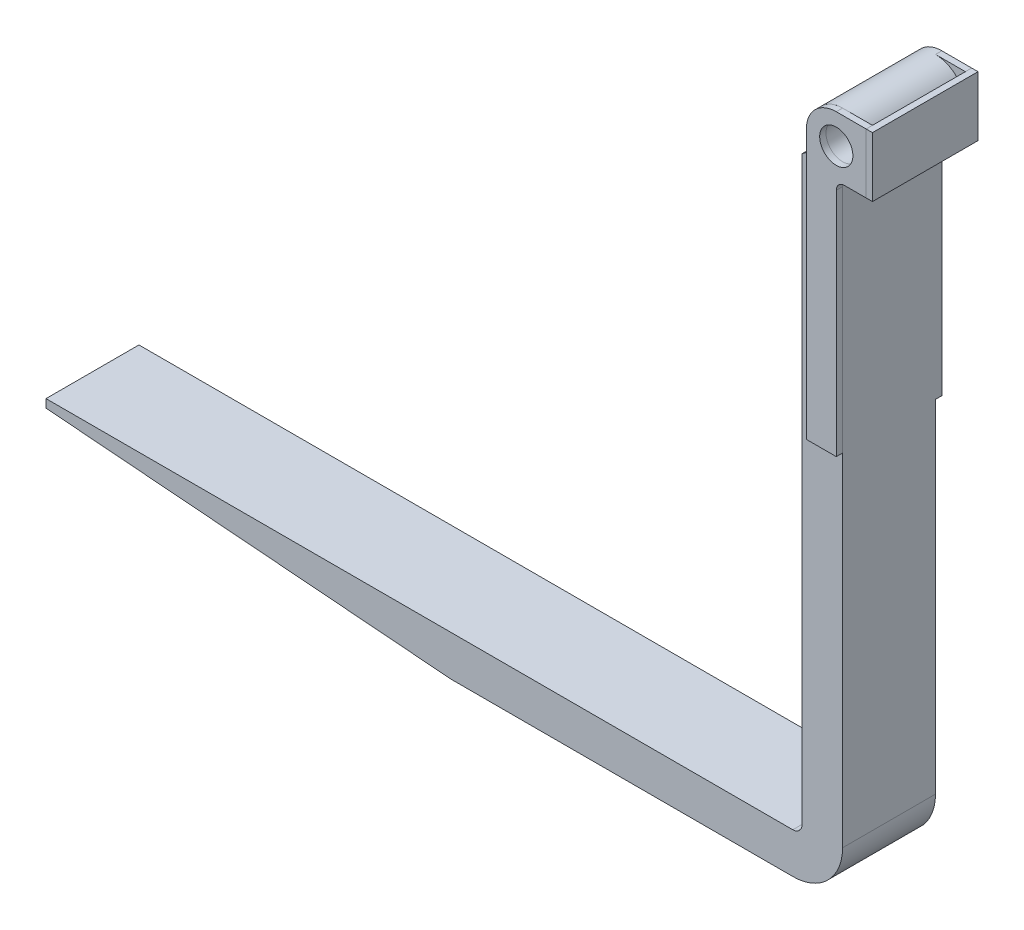
ISO-10303-21;
HEADER;
FILE_DESCRIPTION(('STEP AP214'),'2;1');
FILE_NAME('part.step','',(''),(''),'','','');
FILE_SCHEMA(('AUTOMOTIVE_DESIGN { 1 0 10303 214 1 1 1 1 }'));
ENDSEC;
DATA;
#1=APPLICATION_CONTEXT('core data for automotive mechanical design processes');
#2=APPLICATION_PROTOCOL_DEFINITION('international standard','automotive_design',2000,#1);
#3=PRODUCT_CONTEXT('',#1,'mechanical');
#4=PRODUCT('Part','Part','',(#3));
#5=PRODUCT_RELATED_PRODUCT_CATEGORY('part','',(#4));
#6=PRODUCT_DEFINITION_FORMATION('','',#4);
#7=PRODUCT_DEFINITION_CONTEXT('part definition',#1,'design');
#8=PRODUCT_DEFINITION('design','',#6,#7);
#9=PRODUCT_DEFINITION_SHAPE('','',#8);
#10=(LENGTH_UNIT() NAMED_UNIT(*) SI_UNIT(.MILLI.,.METRE.));
#11=(NAMED_UNIT(*) PLANE_ANGLE_UNIT() SI_UNIT($,.RADIAN.));
#12=(NAMED_UNIT(*) SI_UNIT($,.STERADIAN.) SOLID_ANGLE_UNIT());
#13=UNCERTAINTY_MEASURE_WITH_UNIT(LENGTH_MEASURE(1.E-05),#10,'distance_accuracy_value','');
#14=(GEOMETRIC_REPRESENTATION_CONTEXT(3) GLOBAL_UNCERTAINTY_ASSIGNED_CONTEXT((#13)) GLOBAL_UNIT_ASSIGNED_CONTEXT((#10,
#11,#12)) REPRESENTATION_CONTEXT('',''));
#15=CARTESIAN_POINT('',(0.,0.,0.));
#16=DIRECTION('',(0.,0.,1.));
#17=DIRECTION('',(1.,0.,0.));
#18=AXIS2_PLACEMENT_3D('',#15,#16,#17);
#19=CARTESIAN_POINT('',(54.5,1040.,79.5));
#20=DIRECTION('',(0.,0.,-1.));
#21=DIRECTION('',(-1.,0.,0.));
#22=AXIS2_PLACEMENT_3D('',#19,#20,#21);
#23=PLANE('',#22);
#24=DIRECTION('',(0.,-1.,0.));
#25=VECTOR('',#24,1.);
#26=CARTESIAN_POINT('',(45.,1040.,79.5));
#27=LINE('',#26,#25);
#28=CARTESIAN_POINT('',(45.,1040.,79.5));
#29=VERTEX_POINT('',#28);
#30=CARTESIAN_POINT('',(45.,950.,79.5));
#31=VERTEX_POINT('',#30);
#32=EDGE_CURVE('E110',#29,#31,#27,.T.);
#33=ORIENTED_EDGE('',*,*,#32,.T.);
#34=DIRECTION('',(-1.,0.,0.));
#35=VECTOR('',#34,1.);
#36=CARTESIAN_POINT('',(54.5,950.,79.5));
#37=LINE('',#36,#35);
#38=CARTESIAN_POINT('',(54.5,950.,79.5));
#39=VERTEX_POINT('',#38);
#40=EDGE_CURVE('E12',#39,#31,#37,.T.);
#41=ORIENTED_EDGE('',*,*,#40,.F.);
#42=DIRECTION('',(0.,-1.,0.));
#43=VECTOR('',#42,1.);
#44=CARTESIAN_POINT('',(54.5,1040.,79.5));
#45=LINE('',#44,#43);
#46=CARTESIAN_POINT('',(54.5,1040.,79.5));
#47=VERTEX_POINT('',#46);
#48=EDGE_CURVE('E98',#47,#39,#45,.T.);
#49=ORIENTED_EDGE('',*,*,#48,.F.);
#50=DIRECTION('',(-1.,0.,0.));
#51=VECTOR('',#50,1.);
#52=CARTESIAN_POINT('',(54.5,1040.,79.5));
#53=LINE('',#52,#51);
#54=EDGE_CURVE('E106',#47,#29,#53,.T.);
#55=ORIENTED_EDGE('',*,*,#54,.T.);
#56=EDGE_LOOP('',(#33,#41,#49,#55));
#57=FACE_BOUND('',#56,.T.);
#58=ADVANCED_FACE('F47',(#57),#23,.F.);
#59=CARTESIAN_POINT('',(54.5,950.,79.5));
#60=DIRECTION('',(0.,1.,0.));
#61=DIRECTION('',(0.,0.,1.));
#62=AXIS2_PLACEMENT_3D('',#59,#60,#61);
#63=PLANE('',#62);
#64=DIRECTION('',(0.,0.,-1.));
#65=VECTOR('',#64,1.);
#66=CARTESIAN_POINT('',(45.,950.,79.5));
#67=LINE('',#66,#65);
#68=CARTESIAN_POINT('',(45.,950.,-79.5));
#69=VERTEX_POINT('',#68);
#70=EDGE_CURVE('E102',#31,#69,#67,.T.);
#71=ORIENTED_EDGE('',*,*,#70,.T.);
#72=DIRECTION('',(-1.,0.,0.));
#73=VECTOR('',#72,1.);
#74=CARTESIAN_POINT('',(54.5,950.,-79.5));
#75=LINE('',#74,#73);
#76=CARTESIAN_POINT('',(54.5,950.,-79.5));
#77=VERTEX_POINT('',#76);
#78=EDGE_CURVE('E55',#77,#69,#75,.T.);
#79=ORIENTED_EDGE('',*,*,#78,.F.);
#80=DIRECTION('',(0.,0.,-1.));
#81=VECTOR('',#80,1.);
#82=CARTESIAN_POINT('',(54.5,950.,79.5));
#83=LINE('',#82,#81);
#84=EDGE_CURVE('E93',#39,#77,#83,.T.);
#85=ORIENTED_EDGE('',*,*,#84,.F.);
#86=ORIENTED_EDGE('',*,*,#40,.T.);
#87=EDGE_LOOP('',(#71,#79,#85,#86));
#88=FACE_BOUND('',#87,.T.);
#89=ADVANCED_FACE('F101',(#88),#63,.F.);
#90=CARTESIAN_POINT('',(54.5,1040.,-79.5));
#91=DIRECTION('',(0.,0.,1.));
#92=DIRECTION('',(1.,0.,0.));
#93=AXIS2_PLACEMENT_3D('',#90,#91,#92);
#94=PLANE('',#93);
#95=DIRECTION('',(0.,1.,0.));
#96=VECTOR('',#95,1.);
#97=CARTESIAN_POINT('',(45.,1040.,-79.5));
#98=LINE('',#97,#96);
#99=CARTESIAN_POINT('',(45.,1040.,-79.5));
#100=VERTEX_POINT('',#99);
#101=EDGE_CURVE('E80',#69,#100,#98,.T.);
#102=ORIENTED_EDGE('',*,*,#101,.T.);
#103=DIRECTION('',(-1.,0.,0.));
#104=VECTOR('',#103,1.);
#105=CARTESIAN_POINT('',(54.5,1040.,-79.5));
#106=LINE('',#105,#104);
#107=CARTESIAN_POINT('',(54.5,1040.,-79.5));
#108=VERTEX_POINT('',#107);
#109=EDGE_CURVE('E103',#108,#100,#106,.T.);
#110=ORIENTED_EDGE('',*,*,#109,.F.);
#111=DIRECTION('',(0.,1.,0.));
#112=VECTOR('',#111,1.);
#113=CARTESIAN_POINT('',(54.5,1040.,-79.5));
#114=LINE('',#113,#112);
#115=EDGE_CURVE('E96',#77,#108,#114,.T.);
#116=ORIENTED_EDGE('',*,*,#115,.F.);
#117=ORIENTED_EDGE('',*,*,#78,.T.);
#118=EDGE_LOOP('',(#102,#110,#116,#117));
#119=FACE_BOUND('',#118,.T.);
#120=ADVANCED_FACE('F104',(#119),#94,.F.);
#121=CARTESIAN_POINT('',(54.5,1040.,79.5));
#122=DIRECTION('',(0.,-1.,0.));
#123=DIRECTION('',(0.,0.,-1.));
#124=AXIS2_PLACEMENT_3D('',#121,#122,#123);
#125=PLANE('',#124);
#126=DIRECTION('',(0.,0.,1.));
#127=VECTOR('',#126,1.);
#128=CARTESIAN_POINT('',(45.,1040.,79.5));
#129=LINE('',#128,#127);
#130=EDGE_CURVE('E86',#100,#29,#129,.T.);
#131=ORIENTED_EDGE('',*,*,#130,.T.);
#132=ORIENTED_EDGE('',*,*,#54,.F.);
#133=DIRECTION('',(0.,0.,1.));
#134=VECTOR('',#133,1.);
#135=CARTESIAN_POINT('',(54.5,1040.,79.5));
#136=LINE('',#135,#134);
#137=EDGE_CURVE('E63',#108,#47,#136,.T.);
#138=ORIENTED_EDGE('',*,*,#137,.F.);
#139=ORIENTED_EDGE('',*,*,#109,.T.);
#140=EDGE_LOOP('',(#131,#132,#138,#139));
#141=FACE_BOUND('',#140,.T.);
#142=ADVANCED_FACE('F117',(#141),#125,.F.);
#143=CARTESIAN_POINT('',(54.5,0.,0.));
#144=DIRECTION('',(1.,0.,0.));
#145=DIRECTION('',(0.,0.,-1.));
#146=AXIS2_PLACEMENT_3D('',#143,#144,#145);
#147=PLANE('',#146);
#148=ORIENTED_EDGE('',*,*,#48,.T.);
#149=ORIENTED_EDGE('',*,*,#84,.T.);
#150=ORIENTED_EDGE('',*,*,#115,.T.);
#151=ORIENTED_EDGE('',*,*,#137,.T.);
#152=EDGE_LOOP('',(#148,#149,#150,#151));
#153=FACE_BOUND('',#152,.T.);
#154=ADVANCED_FACE('F94',(#153),#147,.T.);
#155=CARTESIAN_POINT('',(45.,0.,0.));
#156=DIRECTION('',(1.,0.,0.));
#157=DIRECTION('',(0.,0.,-1.));
#158=AXIS2_PLACEMENT_3D('',#155,#156,#157);
#159=PLANE('',#158);
#160=ORIENTED_EDGE('',*,*,#32,.F.);
#161=ORIENTED_EDGE('',*,*,#130,.F.);
#162=ORIENTED_EDGE('',*,*,#101,.F.);
#163=ORIENTED_EDGE('',*,*,#70,.F.);
#164=EDGE_LOOP('',(#160,#161,#162,#163));
#165=FACE_BOUND('',#164,.T.);
#166=ADVANCED_FACE('F120',(#165),#159,.F.);
#167=CLOSED_SHELL('',(#58,#89,#120,#142,#154,#166));
#168=MANIFOLD_SOLID_BREP('B2',#167);
#169=CARTESIAN_POINT('',(0.,995.,79.5));
#170=DIRECTION('',(0.,0.,-1.));
#171=DIRECTION('',(-1.,0.,0.));
#172=AXIS2_PLACEMENT_3D('',#169,#170,#171);
#173=CYLINDRICAL_SURFACE('',#172,45.);
#174=CARTESIAN_POINT('',(0.,995.,70.));
#175=DIRECTION('',(0.,0.,1.));
#176=DIRECTION('',(1.,0.,0.));
#177=AXIS2_PLACEMENT_3D('',#174,#175,#176);
#178=CIRCLE('',#177,45.);
#179=CARTESIAN_POINT('',(0.,1040.,70.));
#180=VERTEX_POINT('',#179);
#181=CARTESIAN_POINT('',(-45.,995.,70.));
#182=VERTEX_POINT('',#181);
#183=EDGE_CURVE('E279',#180,#182,#178,.T.);
#184=ORIENTED_EDGE('',*,*,#183,.T.);
#185=DIRECTION('',(0.,0.,-1.));
#186=VECTOR('',#185,1.);
#187=CARTESIAN_POINT('',(-45.,995.,79.5));
#188=LINE('',#187,#186);
#189=CARTESIAN_POINT('',(-45.,995.,79.5));
#190=VERTEX_POINT('',#189);
#191=EDGE_CURVE('E45',#190,#182,#188,.T.);
#192=ORIENTED_EDGE('',*,*,#191,.F.);
#193=CARTESIAN_POINT('',(0.,995.,79.5));
#194=DIRECTION('',(0.,0.,1.));
#195=DIRECTION('',(1.,0.,0.));
#196=AXIS2_PLACEMENT_3D('',#193,#194,#195);
#197=CIRCLE('',#196,45.);
#198=CARTESIAN_POINT('',(0.,1040.,79.5));
#199=VERTEX_POINT('',#198);
#200=EDGE_CURVE('E325',#199,#190,#197,.T.);
#201=ORIENTED_EDGE('',*,*,#200,.F.);
#202=DIRECTION('',(0.,0.,-1.));
#203=VECTOR('',#202,1.);
#204=CARTESIAN_POINT('',(0.,1040.,79.5));
#205=LINE('',#204,#203);
#206=EDGE_CURVE('E272',#199,#180,#205,.T.);
#207=ORIENTED_EDGE('',*,*,#206,.T.);
#208=EDGE_LOOP('',(#184,#192,#201,#207));
#209=FACE_BOUND('',#208,.T.);
#210=ADVANCED_FACE('F179',(#209),#173,.T.);
#211=CARTESIAN_POINT('',(-45.,0.,79.5));
#212=DIRECTION('',(1.,0.,0.));
#213=DIRECTION('',(0.,0.,-1.));
#214=AXIS2_PLACEMENT_3D('',#211,#212,#213);
#215=PLANE('',#214);
#216=DIRECTION('',(0.,-1.,0.));
#217=VECTOR('',#216,1.);
#218=CARTESIAN_POINT('',(-45.,0.,70.));
#219=LINE('',#218,#217);
#220=CARTESIAN_POINT('',(-45.,590.,70.));
#221=VERTEX_POINT('',#220);
#222=EDGE_CURVE('E282',#182,#221,#219,.T.);
#223=ORIENTED_EDGE('',*,*,#222,.T.);
#224=DIRECTION('',(0.,0.,-1.));
#225=VECTOR('',#224,1.);
#226=CARTESIAN_POINT('',(-45.,590.,79.5));
#227=LINE('',#226,#225);
#228=CARTESIAN_POINT('',(-45.,590.,79.5));
#229=VERTEX_POINT('',#228);
#230=EDGE_CURVE('E188',#229,#221,#227,.T.);
#231=ORIENTED_EDGE('',*,*,#230,.F.);
#232=DIRECTION('',(0.,-1.,0.));
#233=VECTOR('',#232,1.);
#234=CARTESIAN_POINT('',(-45.,0.,79.5));
#235=LINE('',#234,#233);
#236=EDGE_CURVE('E239',#190,#229,#235,.T.);
#237=ORIENTED_EDGE('',*,*,#236,.F.);
#238=ORIENTED_EDGE('',*,*,#191,.T.);
#239=EDGE_LOOP('',(#223,#231,#237,#238));
#240=FACE_BOUND('',#239,.T.);
#241=ADVANCED_FACE('F344',(#240),#215,.F.);
#242=CARTESIAN_POINT('',(0.,590.,79.5));
#243=DIRECTION('',(0.,1.,0.));
#244=DIRECTION('',(0.,0.,1.));
#245=AXIS2_PLACEMENT_3D('',#242,#243,#244);
#246=PLANE('',#245);
#247=DIRECTION('',(1.,0.,0.));
#248=VECTOR('',#247,1.);
#249=CARTESIAN_POINT('',(0.,590.,70.));
#250=LINE('',#249,#248);
#251=CARTESIAN_POINT('',(0.,590.,70.));
#252=VERTEX_POINT('',#251);
#253=EDGE_CURVE('E284',#221,#252,#250,.T.);
#254=ORIENTED_EDGE('',*,*,#253,.T.);
#255=DIRECTION('',(0.,0.,-1.));
#256=VECTOR('',#255,1.);
#257=CARTESIAN_POINT('',(0.,590.,79.5));
#258=LINE('',#257,#256);
#259=CARTESIAN_POINT('',(0.,590.,79.5));
#260=VERTEX_POINT('',#259);
#261=EDGE_CURVE('E300',#260,#252,#258,.T.);
#262=ORIENTED_EDGE('',*,*,#261,.F.);
#263=DIRECTION('',(1.,0.,0.));
#264=VECTOR('',#263,1.);
#265=CARTESIAN_POINT('',(0.,590.,79.5));
#266=LINE('',#265,#264);
#267=EDGE_CURVE('E308',#229,#260,#266,.T.);
#268=ORIENTED_EDGE('',*,*,#267,.F.);
#269=ORIENTED_EDGE('',*,*,#230,.T.);
#270=EDGE_LOOP('',(#254,#262,#268,#269));
#271=FACE_BOUND('',#270,.T.);
#272=ADVANCED_FACE('F306',(#271),#246,.F.);
#273=CARTESIAN_POINT('',(0.,0.,79.5));
#274=DIRECTION('',(-1.,0.,0.));
#275=DIRECTION('',(0.,0.,1.));
#276=AXIS2_PLACEMENT_3D('',#273,#274,#275);
#277=PLANE('',#276);
#278=DIRECTION('',(0.,1.,0.));
#279=VECTOR('',#278,1.);
#280=CARTESIAN_POINT('',(0.,0.,70.));
#281=LINE('',#280,#279);
#282=CARTESIAN_POINT('',(0.,937.5,70.));
#283=VERTEX_POINT('',#282);
#284=EDGE_CURVE('E286',#252,#283,#281,.T.);
#285=ORIENTED_EDGE('',*,*,#284,.T.);
#286=DIRECTION('',(0.,0.,-1.));
#287=VECTOR('',#286,1.);
#288=CARTESIAN_POINT('',(0.,937.5,79.5));
#289=LINE('',#288,#287);
#290=CARTESIAN_POINT('',(0.,937.5,79.5));
#291=VERTEX_POINT('',#290);
#292=EDGE_CURVE('E297',#291,#283,#289,.T.);
#293=ORIENTED_EDGE('',*,*,#292,.F.);
#294=DIRECTION('',(0.,1.,0.));
#295=VECTOR('',#294,1.);
#296=CARTESIAN_POINT('',(0.,0.,79.5));
#297=LINE('',#296,#295);
#298=EDGE_CURVE('E320',#260,#291,#297,.T.);
#299=ORIENTED_EDGE('',*,*,#298,.F.);
#300=ORIENTED_EDGE('',*,*,#261,.T.);
#301=EDGE_LOOP('',(#285,#293,#299,#300));
#302=FACE_BOUND('',#301,.T.);
#303=ADVANCED_FACE('F316',(#302),#277,.F.);
#304=CARTESIAN_POINT('',(12.5,937.5,79.5));
#305=DIRECTION('',(0.,0.,-1.));
#306=DIRECTION('',(-1.,0.,0.));
#307=AXIS2_PLACEMENT_3D('',#304,#305,#306);
#308=CYLINDRICAL_SURFACE('',#307,12.5);
#309=CARTESIAN_POINT('',(12.5,937.5,70.));
#310=DIRECTION('',(0.,0.,1.));
#311=DIRECTION('',(1.,0.,0.));
#312=AXIS2_PLACEMENT_3D('',#309,#310,#311);
#313=CIRCLE('',#312,12.5);
#314=CARTESIAN_POINT('',(12.5000000000001,950.,70.));
#315=VERTEX_POINT('',#314);
#316=EDGE_CURVE('E288',#283,#315,#313,.F.);
#317=ORIENTED_EDGE('',*,*,#316,.T.);
#318=DIRECTION('',(0.,0.,-1.));
#319=VECTOR('',#318,1.);
#320=CARTESIAN_POINT('',(12.5000000000001,950.,79.5));
#321=LINE('',#320,#319);
#322=CARTESIAN_POINT('',(12.5000000000001,950.,79.5));
#323=VERTEX_POINT('',#322);
#324=EDGE_CURVE('E267',#323,#315,#321,.T.);
#325=ORIENTED_EDGE('',*,*,#324,.F.);
#326=CARTESIAN_POINT('',(12.5,937.5,79.5));
#327=DIRECTION('',(0.,0.,1.));
#328=DIRECTION('',(1.,0.,0.));
#329=AXIS2_PLACEMENT_3D('',#326,#327,#328);
#330=CIRCLE('',#329,12.5);
#331=EDGE_CURVE('E258',#291,#323,#330,.F.);
#332=ORIENTED_EDGE('',*,*,#331,.F.);
#333=ORIENTED_EDGE('',*,*,#292,.T.);
#334=EDGE_LOOP('',(#317,#325,#332,#333));
#335=FACE_BOUND('',#334,.T.);
#336=ADVANCED_FACE('F319',(#335),#308,.F.);
#337=CARTESIAN_POINT('',(0.,950.,79.5));
#338=DIRECTION('',(0.,1.,0.));
#339=DIRECTION('',(0.,0.,1.));
#340=AXIS2_PLACEMENT_3D('',#337,#338,#339);
#341=PLANE('',#340);
#342=DIRECTION('',(1.,0.,0.));
#343=VECTOR('',#342,1.);
#344=CARTESIAN_POINT('',(0.,950.,70.));
#345=LINE('',#344,#343);
#346=CARTESIAN_POINT('',(45.,950.,70.));
#347=VERTEX_POINT('',#346);
#348=EDGE_CURVE('E266',#315,#347,#345,.T.);
#349=ORIENTED_EDGE('',*,*,#348,.T.);
#350=DIRECTION('',(0.,0.,-1.));
#351=VECTOR('',#350,1.);
#352=CARTESIAN_POINT('',(45.,950.,79.5));
#353=LINE('',#352,#351);
#354=CARTESIAN_POINT('',(45.,950.,79.5));
#355=VERTEX_POINT('',#354);
#356=EDGE_CURVE('E263',#355,#347,#353,.T.);
#357=ORIENTED_EDGE('',*,*,#356,.F.);
#358=DIRECTION('',(1.,0.,0.));
#359=VECTOR('',#358,1.);
#360=CARTESIAN_POINT('',(0.,950.,79.5));
#361=LINE('',#360,#359);
#362=EDGE_CURVE('E252',#323,#355,#361,.T.);
#363=ORIENTED_EDGE('',*,*,#362,.F.);
#364=ORIENTED_EDGE('',*,*,#324,.T.);
#365=EDGE_LOOP('',(#349,#357,#363,#364));
#366=FACE_BOUND('',#365,.T.);
#367=ADVANCED_FACE('F264',(#366),#341,.F.);
#368=CARTESIAN_POINT('',(45.,0.,79.5));
#369=DIRECTION('',(-1.,0.,0.));
#370=DIRECTION('',(0.,0.,1.));
#371=AXIS2_PLACEMENT_3D('',#368,#369,#370);
#372=PLANE('',#371);
#373=DIRECTION('',(0.,1.,0.));
#374=VECTOR('',#373,1.);
#375=CARTESIAN_POINT('',(45.,0.,70.));
#376=LINE('',#375,#374);
#377=CARTESIAN_POINT('',(45.,1040.,70.));
#378=VERTEX_POINT('',#377);
#379=EDGE_CURVE('E225',#347,#378,#376,.T.);
#380=ORIENTED_EDGE('',*,*,#379,.T.);
#381=DIRECTION('',(0.,0.,-1.));
#382=VECTOR('',#381,1.);
#383=CARTESIAN_POINT('',(45.,1040.,79.5));
#384=LINE('',#383,#382);
#385=CARTESIAN_POINT('',(45.,1040.,79.5));
#386=VERTEX_POINT('',#385);
#387=EDGE_CURVE('E268',#386,#378,#384,.T.);
#388=ORIENTED_EDGE('',*,*,#387,.F.);
#389=DIRECTION('',(0.,1.,0.));
#390=VECTOR('',#389,1.);
#391=CARTESIAN_POINT('',(45.,0.,79.5));
#392=LINE('',#391,#390);
#393=EDGE_CURVE('E256',#355,#386,#392,.T.);
#394=ORIENTED_EDGE('',*,*,#393,.F.);
#395=ORIENTED_EDGE('',*,*,#356,.T.);
#396=EDGE_LOOP('',(#380,#388,#394,#395));
#397=FACE_BOUND('',#396,.T.);
#398=ADVANCED_FACE('F270',(#397),#372,.F.);
#399=CARTESIAN_POINT('',(0.,995.,79.5));
#400=DIRECTION('',(0.,0.,-1.));
#401=DIRECTION('',(-1.,0.,0.));
#402=AXIS2_PLACEMENT_3D('',#399,#400,#401);
#403=CYLINDRICAL_SURFACE('',#402,25.);
#404=CARTESIAN_POINT('',(0.,995.,79.5));
#405=DIRECTION('',(0.,0.,1.));
#406=DIRECTION('',(1.,0.,0.));
#407=AXIS2_PLACEMENT_3D('',#404,#405,#406);
#408=CIRCLE('',#407,25.);
#409=CARTESIAN_POINT('',(25.,995.,79.5));
#410=VERTEX_POINT('',#409);
#411=EDGE_CURVE('E293',#410,#410,#408,.F.);
#412=ORIENTED_EDGE('',*,*,#411,.F.);
#413=EDGE_LOOP('',(#412));
#414=FACE_BOUND('',#413,.T.);
#415=CARTESIAN_POINT('',(0.,995.,70.));
#416=DIRECTION('',(0.,0.,1.));
#417=DIRECTION('',(1.,0.,0.));
#418=AXIS2_PLACEMENT_3D('',#415,#416,#417);
#419=CIRCLE('',#418,25.);
#420=CARTESIAN_POINT('',(25.,995.,70.));
#421=VERTEX_POINT('',#420);
#422=EDGE_CURVE('E276',#421,#421,#419,.F.);
#423=ORIENTED_EDGE('',*,*,#422,.T.);
#424=EDGE_LOOP('',(#423));
#425=FACE_BOUND('',#424,.T.);
#426=ADVANCED_FACE('F181',(#414,#425),#403,.F.);
#427=CARTESIAN_POINT('',(0.,1040.,79.5));
#428=DIRECTION('',(0.,-1.,0.));
#429=DIRECTION('',(0.,0.,-1.));
#430=AXIS2_PLACEMENT_3D('',#427,#428,#429);
#431=PLANE('',#430);
#432=DIRECTION('',(-1.,0.,0.));
#433=VECTOR('',#432,1.);
#434=CARTESIAN_POINT('',(0.,1040.,70.));
#435=LINE('',#434,#433);
#436=EDGE_CURVE('E231',#378,#180,#435,.T.);
#437=ORIENTED_EDGE('',*,*,#436,.T.);
#438=ORIENTED_EDGE('',*,*,#206,.F.);
#439=DIRECTION('',(-1.,0.,0.));
#440=VECTOR('',#439,1.);
#441=CARTESIAN_POINT('',(0.,1040.,79.5));
#442=LINE('',#441,#440);
#443=EDGE_CURVE('E196',#386,#199,#442,.T.);
#444=ORIENTED_EDGE('',*,*,#443,.F.);
#445=ORIENTED_EDGE('',*,*,#387,.T.);
#446=EDGE_LOOP('',(#437,#438,#444,#445));
#447=FACE_BOUND('',#446,.T.);
#448=ADVANCED_FACE('F333',(#447),#431,.F.);
#449=CARTESIAN_POINT('',(0.,0.,79.5));
#450=DIRECTION('',(0.,0.,1.));
#451=DIRECTION('',(1.,0.,0.));
#452=AXIS2_PLACEMENT_3D('',#449,#450,#451);
#453=PLANE('',#452);
#454=ORIENTED_EDGE('',*,*,#411,.T.);
#455=EDGE_LOOP('',(#454));
#456=FACE_BOUND('',#455,.T.);
#457=ORIENTED_EDGE('',*,*,#200,.T.);
#458=ORIENTED_EDGE('',*,*,#236,.T.);
#459=ORIENTED_EDGE('',*,*,#267,.T.);
#460=ORIENTED_EDGE('',*,*,#298,.T.);
#461=ORIENTED_EDGE('',*,*,#331,.T.);
#462=ORIENTED_EDGE('',*,*,#362,.T.);
#463=ORIENTED_EDGE('',*,*,#393,.T.);
#464=ORIENTED_EDGE('',*,*,#443,.T.);
#465=EDGE_LOOP('',(#457,#458,#459,#460,#461,#462,#463,#464));
#466=FACE_BOUND('',#465,.T.);
#467=ADVANCED_FACE('F254',(#456,#466),#453,.T.);
#468=CARTESIAN_POINT('',(0.,0.,70.));
#469=DIRECTION('',(0.,0.,1.));
#470=DIRECTION('',(1.,0.,0.));
#471=AXIS2_PLACEMENT_3D('',#468,#469,#470);
#472=PLANE('',#471);
#473=ORIENTED_EDGE('',*,*,#422,.F.);
#474=EDGE_LOOP('',(#473));
#475=FACE_BOUND('',#474,.T.);
#476=ORIENTED_EDGE('',*,*,#183,.F.);
#477=ORIENTED_EDGE('',*,*,#436,.F.);
#478=ORIENTED_EDGE('',*,*,#379,.F.);
#479=ORIENTED_EDGE('',*,*,#348,.F.);
#480=ORIENTED_EDGE('',*,*,#316,.F.);
#481=ORIENTED_EDGE('',*,*,#284,.F.);
#482=ORIENTED_EDGE('',*,*,#253,.F.);
#483=ORIENTED_EDGE('',*,*,#222,.F.);
#484=EDGE_LOOP('',(#476,#477,#478,#479,#480,#481,#482,#483));
#485=FACE_BOUND('',#484,.T.);
#486=ADVANCED_FACE('F312',(#475,#485),#472,.F.);
#487=CLOSED_SHELL('',(#210,#241,#272,#303,#336,#367,#398,#426,#448,#467,#486));
#488=MANIFOLD_SOLID_BREP('B6',#487);
#489=CARTESIAN_POINT('',(0.,0.,-70.));
#490=DIRECTION('',(0.,0.,-1.));
#491=DIRECTION('',(1.,0.,0.));
#492=AXIS2_PLACEMENT_3D('',#489,#490,#491);
#493=PLANE('',#492);
#494=CARTESIAN_POINT('',(0.,995.,-70.));
#495=DIRECTION('',(0.,0.,-1.));
#496=DIRECTION('',(-1.,0.,0.));
#497=AXIS2_PLACEMENT_3D('',#494,#495,#496);
#498=CIRCLE('',#497,45.);
#499=CARTESIAN_POINT('',(0.,950.,-70.));
#500=VERTEX_POINT('',#499);
#501=CARTESIAN_POINT('',(45.,995.,-70.));
#502=VERTEX_POINT('',#501);
#503=EDGE_CURVE('E594',#500,#502,#498,.F.);
#504=ORIENTED_EDGE('',*,*,#503,.F.);
#505=DIRECTION('',(0.,-1.,0.));
#506=VECTOR('',#505,1.);
#507=CARTESIAN_POINT('',(0.,950.,-70.));
#508=LINE('',#507,#506);
#509=CARTESIAN_POINT('',(0.,937.5,-70.));
#510=VERTEX_POINT('',#509);
#511=EDGE_CURVE('E651',#500,#510,#508,.T.);
#512=ORIENTED_EDGE('',*,*,#511,.T.);
#513=CARTESIAN_POINT('',(12.5,937.5,-70.));
#514=DIRECTION('',(0.,0.,1.));
#515=DIRECTION('',(1.,0.,0.));
#516=AXIS2_PLACEMENT_3D('',#513,#514,#515);
#517=CIRCLE('',#516,12.5);
#518=CARTESIAN_POINT('',(12.5000000000001,950.,-70.));
#519=VERTEX_POINT('',#518);
#520=EDGE_CURVE('E762',#510,#519,#517,.F.);
#521=ORIENTED_EDGE('',*,*,#520,.T.);
#522=DIRECTION('',(1.,0.,0.));
#523=VECTOR('',#522,1.);
#524=CARTESIAN_POINT('',(0.,950.,-70.));
#525=LINE('',#524,#523);
#526=CARTESIAN_POINT('',(45.,950.,-70.));
#527=VERTEX_POINT('',#526);
#528=EDGE_CURVE('E754',#519,#527,#525,.T.);
#529=ORIENTED_EDGE('',*,*,#528,.T.);
#530=DIRECTION('',(0.,1.,0.));
#531=VECTOR('',#530,1.);
#532=CARTESIAN_POINT('',(45.,0.,-70.));
#533=LINE('',#532,#531);
#534=EDGE_CURVE('E654',#527,#502,#533,.T.);
#535=ORIENTED_EDGE('',*,*,#534,.T.);
#536=EDGE_LOOP('',(#504,#512,#521,#529,#535));
#537=FACE_BOUND('',#536,.T.);
#538=ADVANCED_FACE('F442',(#537),#493,.F.);
#539=CARTESIAN_POINT('',(0.,995.,-70.));
#540=DIRECTION('',(0.,0.,1.));
#541=DIRECTION('',(1.,0.,0.));
#542=AXIS2_PLACEMENT_3D('',#539,#540,#541);
#543=CIRCLE('',#542,45.);
#544=CARTESIAN_POINT('',(0.,1040.,-70.));
#545=VERTEX_POINT('',#544);
#546=EDGE_CURVE('E467',#502,#545,#543,.T.);
#547=ORIENTED_EDGE('',*,*,#546,.F.);
#548=CARTESIAN_POINT('',(45.,1040.,-70.));
#549=VERTEX_POINT('',#548);
#550=EDGE_CURVE('E747',#502,#549,#533,.T.);
#551=ORIENTED_EDGE('',*,*,#550,.T.);
#552=DIRECTION('',(-1.,0.,0.));
#553=VECTOR('',#552,1.);
#554=CARTESIAN_POINT('',(0.,1040.,-70.));
#555=LINE('',#554,#553);
#556=EDGE_CURVE('E633',#549,#545,#555,.T.);
#557=ORIENTED_EDGE('',*,*,#556,.T.);
#558=EDGE_LOOP('',(#547,#551,#557));
#559=FACE_BOUND('',#558,.T.);
#560=ADVANCED_FACE('F787',(#559),#493,.F.);
#561=CARTESIAN_POINT('',(-75.,75.,-70.));
#562=DIRECTION('',(0.,0.,-1.));
#563=DIRECTION('',(-1.,0.,0.));
#564=AXIS2_PLACEMENT_3D('',#561,#562,#563);
#565=PLANE('',#564);
#566=DIRECTION('',(0.,1.,0.));
#567=VECTOR('',#566,1.);
#568=CARTESIAN_POINT('',(-61.,950.,-70.));
#569=LINE('',#568,#567);
#570=CARTESIAN_POINT('',(-61.,950.,-70.));
#571=VERTEX_POINT('',#570);
#572=CARTESIAN_POINT('',(-61.,75.0000000000001,-70.));
#573=VERTEX_POINT('',#572);
#574=EDGE_CURVE('E661',#571,#573,#569,.F.);
#575=ORIENTED_EDGE('',*,*,#574,.F.);
#576=DIRECTION('',(0.80472413028408,0.593648948570223,0.));
#577=VECTOR('',#576,1.);
#578=CARTESIAN_POINT('',(-475.33501566307,644.343021232162,-70.));
#579=LINE('',#578,#577);
#580=CARTESIAN_POINT('',(-45.,961.803278688525,-70.));
#581=VERTEX_POINT('',#580);
#582=EDGE_CURVE('E585',#571,#581,#579,.T.);
#583=ORIENTED_EDGE('',*,*,#582,.T.);
#584=DIRECTION('',(0.,-1.,0.));
#585=VECTOR('',#584,1.);
#586=CARTESIAN_POINT('',(-45.,0.,-70.));
#587=LINE('',#586,#585);
#588=CARTESIAN_POINT('',(-45.,590.,-70.));
#589=VERTEX_POINT('',#588);
#590=EDGE_CURVE('E177',#581,#589,#587,.T.);
#591=ORIENTED_EDGE('',*,*,#590,.T.);
#592=DIRECTION('',(1.,0.,0.));
#593=VECTOR('',#592,1.);
#594=CARTESIAN_POINT('',(0.,590.,-70.));
#595=LINE('',#594,#593);
#596=CARTESIAN_POINT('',(0.,590.,-70.));
#597=VERTEX_POINT('',#596);
#598=EDGE_CURVE('E771',#589,#597,#595,.T.);
#599=ORIENTED_EDGE('',*,*,#598,.T.);
#600=CARTESIAN_POINT('',(0.,75.0000000000005,-70.));
#601=VERTEX_POINT('',#600);
#602=EDGE_CURVE('E662',#597,#601,#508,.T.);
#603=ORIENTED_EDGE('',*,*,#602,.T.);
#604=CARTESIAN_POINT('',(-75.,75.,-70.));
#605=DIRECTION('',(0.,0.,-1.));
#606=DIRECTION('',(-1.,0.,0.));
#607=AXIS2_PLACEMENT_3D('',#604,#605,#606);
#608=CIRCLE('',#607,75.);
#609=CARTESIAN_POINT('',(-75.0000000000005,0.,-70.));
#610=VERTEX_POINT('',#609);
#611=EDGE_CURVE('E666',#601,#610,#608,.T.);
#612=ORIENTED_EDGE('',*,*,#611,.T.);
#613=DIRECTION('',(-1.,0.,0.));
#614=VECTOR('',#613,1.);
#615=CARTESIAN_POINT('',(-75.0000000000005,0.,-70.));
#616=LINE('',#615,#614);
#617=CARTESIAN_POINT('',(-590.,0.,-69.9999999999998));
#618=VERTEX_POINT('',#617);
#619=EDGE_CURVE('E714',#610,#618,#616,.T.);
#620=ORIENTED_EDGE('',*,*,#619,.T.);
#621=DIRECTION('',(0.996854130580606,-0.0792580743166545,0.));
#622=VECTOR('',#621,1.);
#623=CARTESIAN_POINT('',(-84.1608042146895,-40.2183622878484,-70.));
#624=LINE('',#623,#622);
#625=CARTESIAN_POINT('',(-1200.,48.4999999999998,-70.));
#626=VERTEX_POINT('',#625);
#627=EDGE_CURVE('E451',#626,#618,#624,.T.);
#628=ORIENTED_EDGE('',*,*,#627,.F.);
#629=DIRECTION('',(0.,1.,0.));
#630=VECTOR('',#629,1.);
#631=CARTESIAN_POINT('',(-1200.,-1.46957615897682E-13,-70.));
#632=LINE('',#631,#630);
#633=CARTESIAN_POINT('',(-1200.,60.9999999999998,-70.));
#634=VERTEX_POINT('',#633);
#635=EDGE_CURVE('E711',#626,#634,#632,.T.);
#636=ORIENTED_EDGE('',*,*,#635,.T.);
#637=DIRECTION('',(-1.,0.,0.));
#638=VECTOR('',#637,1.);
#639=CARTESIAN_POINT('',(-75.0000000000005,61.,-70.));
#640=LINE('',#639,#638);
#641=CARTESIAN_POINT('',(-75.0000000000005,61.,-70.));
#642=VERTEX_POINT('',#641);
#643=EDGE_CURVE('E716',#642,#634,#640,.T.);
#644=ORIENTED_EDGE('',*,*,#643,.F.);
#645=CARTESIAN_POINT('',(-75.,75.,-70.));
#646=DIRECTION('',(0.,0.,1.));
#647=DIRECTION('',(1.,0.,0.));
#648=AXIS2_PLACEMENT_3D('',#645,#646,#647);
#649=CIRCLE('',#648,14.);
#650=EDGE_CURVE('E664',#573,#642,#649,.F.);
#651=ORIENTED_EDGE('',*,*,#650,.F.);
#652=EDGE_LOOP('',(#575,#583,#591,#599,#603,#612,#620,#628,#636,#644,#651));
#653=FACE_BOUND('',#652,.T.);
#654=ADVANCED_FACE('F709',(#653),#565,.T.);
#655=CARTESIAN_POINT('',(-75.0000000000005,61.,70.));
#656=DIRECTION('',(0.,-1.,0.));
#657=DIRECTION('',(1.,0.,0.));
#658=AXIS2_PLACEMENT_3D('',#655,#656,#657);
#659=PLANE('',#658);
#660=ORIENTED_EDGE('',*,*,#643,.T.);
#661=DIRECTION('',(0.,0.,-1.));
#662=VECTOR('',#661,1.);
#663=CARTESIAN_POINT('',(-1200.,60.9999999999998,70.));
#664=LINE('',#663,#662);
#665=CARTESIAN_POINT('',(-1200.,60.9999999999998,70.));
#666=VERTEX_POINT('',#665);
#667=EDGE_CURVE('E692',#666,#634,#664,.T.);
#668=ORIENTED_EDGE('',*,*,#667,.F.);
#669=DIRECTION('',(-1.,0.,0.));
#670=VECTOR('',#669,1.);
#671=CARTESIAN_POINT('',(-75.0000000000005,61.,70.));
#672=LINE('',#671,#670);
#673=CARTESIAN_POINT('',(-75.0000000000005,61.,70.));
#674=VERTEX_POINT('',#673);
#675=EDGE_CURVE('E678',#674,#666,#672,.T.);
#676=ORIENTED_EDGE('',*,*,#675,.F.);
#677=DIRECTION('',(0.,0.,-1.));
#678=VECTOR('',#677,1.);
#679=CARTESIAN_POINT('',(-75.0000000000005,61.,70.));
#680=LINE('',#679,#678);
#681=EDGE_CURVE('E679',#674,#642,#680,.T.);
#682=ORIENTED_EDGE('',*,*,#681,.T.);
#683=EDGE_LOOP('',(#660,#668,#676,#682));
#684=FACE_BOUND('',#683,.T.);
#685=ADVANCED_FACE('F444',(#684),#659,.F.);
#686=CARTESIAN_POINT('',(-1200.,-1.46957615897682E-13,70.));
#687=DIRECTION('',(-1.,0.,0.));
#688=DIRECTION('',(0.,-1.,0.));
#689=AXIS2_PLACEMENT_3D('',#686,#687,#688);
#690=PLANE('',#689);
#691=DIRECTION('',(0.,0.,-1.));
#692=VECTOR('',#691,1.);
#693=CARTESIAN_POINT('',(-1200.,48.4999999999999,2166.14061172003));
#694=LINE('',#693,#692);
#695=CARTESIAN_POINT('',(-1200.,48.4999999999998,70.));
#696=VERTEX_POINT('',#695);
#697=EDGE_CURVE('E706',#696,#626,#694,.T.);
#698=ORIENTED_EDGE('',*,*,#697,.F.);
#699=DIRECTION('',(0.,1.,0.));
#700=VECTOR('',#699,1.);
#701=CARTESIAN_POINT('',(-1200.,-1.46957615897682E-13,70.));
#702=LINE('',#701,#700);
#703=EDGE_CURVE('E731',#696,#666,#702,.T.);
#704=ORIENTED_EDGE('',*,*,#703,.T.);
#705=ORIENTED_EDGE('',*,*,#667,.T.);
#706=ORIENTED_EDGE('',*,*,#635,.F.);
#707=EDGE_LOOP('',(#698,#704,#705,#706));
#708=FACE_BOUND('',#707,.T.);
#709=ADVANCED_FACE('F715',(#708),#690,.T.);
#710=CARTESIAN_POINT('',(-75.0000000000005,0.,70.));
#711=DIRECTION('',(0.,-1.,0.));
#712=DIRECTION('',(1.,0.,0.));
#713=AXIS2_PLACEMENT_3D('',#710,#711,#712);
#714=PLANE('',#713);
#715=DIRECTION('',(0.,0.,-1.));
#716=VECTOR('',#715,1.);
#717=CARTESIAN_POINT('',(-590.,0.,2166.14061172003));
#718=LINE('',#717,#716);
#719=CARTESIAN_POINT('',(-589.999999999999,0.,70.));
#720=VERTEX_POINT('',#719);
#721=EDGE_CURVE('E705',#720,#618,#718,.T.);
#722=ORIENTED_EDGE('',*,*,#721,.T.);
#723=ORIENTED_EDGE('',*,*,#619,.F.);
#724=DIRECTION('',(0.,0.,-1.));
#725=VECTOR('',#724,1.);
#726=CARTESIAN_POINT('',(-75.0000000000005,0.,70.));
#727=LINE('',#726,#725);
#728=CARTESIAN_POINT('',(-75.0000000000005,0.,70.));
#729=VERTEX_POINT('',#728);
#730=EDGE_CURVE('E691',#729,#610,#727,.T.);
#731=ORIENTED_EDGE('',*,*,#730,.F.);
#732=DIRECTION('',(-1.,0.,0.));
#733=VECTOR('',#732,1.);
#734=CARTESIAN_POINT('',(-75.0000000000005,0.,70.));
#735=LINE('',#734,#733);
#736=EDGE_CURVE('E728',#729,#720,#735,.T.);
#737=ORIENTED_EDGE('',*,*,#736,.T.);
#738=EDGE_LOOP('',(#722,#723,#731,#737));
#739=FACE_BOUND('',#738,.T.);
#740=ADVANCED_FACE('F823',(#739),#714,.T.);
#741=CARTESIAN_POINT('',(-75.,75.,70.));
#742=DIRECTION('',(0.,0.,-1.));
#743=DIRECTION('',(-1.,0.,0.));
#744=AXIS2_PLACEMENT_3D('',#741,#742,#743);
#745=CYLINDRICAL_SURFACE('',#744,75.);
#746=ORIENTED_EDGE('',*,*,#611,.F.);
#747=DIRECTION('',(0.,0.,-1.));
#748=VECTOR('',#747,1.);
#749=CARTESIAN_POINT('',(0.,75.0000000000005,70.));
#750=LINE('',#749,#748);
#751=CARTESIAN_POINT('',(0.,75.0000000000005,70.));
#752=VERTEX_POINT('',#751);
#753=EDGE_CURVE('E688',#752,#601,#750,.T.);
#754=ORIENTED_EDGE('',*,*,#753,.F.);
#755=CARTESIAN_POINT('',(-75.,75.,70.));
#756=DIRECTION('',(0.,0.,-1.));
#757=DIRECTION('',(-1.,0.,0.));
#758=AXIS2_PLACEMENT_3D('',#755,#756,#757);
#759=CIRCLE('',#758,75.);
#760=EDGE_CURVE('E725',#752,#729,#759,.T.);
#761=ORIENTED_EDGE('',*,*,#760,.T.);
#762=ORIENTED_EDGE('',*,*,#730,.T.);
#763=EDGE_LOOP('',(#746,#754,#761,#762));
#764=FACE_BOUND('',#763,.T.);
#765=ADVANCED_FACE('F827',(#764),#745,.T.);
#766=CARTESIAN_POINT('',(0.,950.,70.));
#767=DIRECTION('',(1.,0.,0.));
#768=DIRECTION('',(0.,0.,-1.));
#769=AXIS2_PLACEMENT_3D('',#766,#767,#768);
#770=PLANE('',#769);
#771=DIRECTION('',(0.,0.,1.));
#772=VECTOR('',#771,1.);
#773=CARTESIAN_POINT('',(0.,937.5,-79.5));
#774=LINE('',#773,#772);
#775=CARTESIAN_POINT('',(0.,937.5,-79.5));
#776=VERTEX_POINT('',#775);
#777=EDGE_CURVE('E660',#776,#510,#774,.T.);
#778=ORIENTED_EDGE('',*,*,#777,.T.);
#779=ORIENTED_EDGE('',*,*,#511,.F.);
#780=DIRECTION('',(0.,0.,-1.));
#781=VECTOR('',#780,1.);
#782=CARTESIAN_POINT('',(0.,950.,70.));
#783=LINE('',#782,#781);
#784=CARTESIAN_POINT('',(0.,950.,70.));
#785=VERTEX_POINT('',#784);
#786=EDGE_CURVE('E646',#785,#500,#783,.T.);
#787=ORIENTED_EDGE('',*,*,#786,.F.);
#788=DIRECTION('',(0.,-1.,0.));
#789=VECTOR('',#788,1.);
#790=CARTESIAN_POINT('',(0.,950.,70.));
#791=LINE('',#790,#789);
#792=EDGE_CURVE('E602',#785,#752,#791,.T.);
#793=ORIENTED_EDGE('',*,*,#792,.T.);
#794=ORIENTED_EDGE('',*,*,#753,.T.);
#795=ORIENTED_EDGE('',*,*,#602,.F.);
#796=DIRECTION('',(0.,0.,1.));
#797=VECTOR('',#796,1.);
#798=CARTESIAN_POINT('',(0.,590.,-79.5));
#799=LINE('',#798,#797);
#800=CARTESIAN_POINT('',(0.,590.,-79.5));
#801=VERTEX_POINT('',#800);
#802=EDGE_CURVE('E768',#801,#597,#799,.T.);
#803=ORIENTED_EDGE('',*,*,#802,.F.);
#804=DIRECTION('',(0.,1.,0.));
#805=VECTOR('',#804,1.);
#806=CARTESIAN_POINT('',(0.,0.,-79.5));
#807=LINE('',#806,#805);
#808=EDGE_CURVE('E763',#801,#776,#807,.T.);
#809=ORIENTED_EDGE('',*,*,#808,.T.);
#810=EDGE_LOOP('',(#778,#779,#787,#793,#794,#795,#803,#809));
#811=FACE_BOUND('',#810,.T.);
#812=ADVANCED_FACE('F657',(#811),#770,.T.);
#813=CARTESIAN_POINT('',(-61.,950.,70.));
#814=DIRECTION('',(1.,0.,0.));
#815=DIRECTION('',(0.,0.,-1.));
#816=AXIS2_PLACEMENT_3D('',#813,#814,#815);
#817=PLANE('',#816);
#818=ORIENTED_EDGE('',*,*,#574,.T.);
#819=DIRECTION('',(0.,0.,-1.));
#820=VECTOR('',#819,1.);
#821=CARTESIAN_POINT('',(-61.,75.0000000000001,70.));
#822=LINE('',#821,#820);
#823=CARTESIAN_POINT('',(-61.,75.0000000000001,70.));
#824=VERTEX_POINT('',#823);
#825=EDGE_CURVE('E682',#824,#573,#822,.T.);
#826=ORIENTED_EDGE('',*,*,#825,.F.);
#827=DIRECTION('',(0.,1.,0.));
#828=VECTOR('',#827,1.);
#829=CARTESIAN_POINT('',(-61.,950.,70.));
#830=LINE('',#829,#828);
#831=CARTESIAN_POINT('',(-61.,950.,70.));
#832=VERTEX_POINT('',#831);
#833=EDGE_CURVE('E722',#832,#824,#830,.F.);
#834=ORIENTED_EDGE('',*,*,#833,.F.);
#835=DIRECTION('',(0.,0.,-1.));
#836=VECTOR('',#835,1.);
#837=CARTESIAN_POINT('',(-61.,950.,70.));
#838=LINE('',#837,#836);
#839=EDGE_CURVE('E582',#832,#571,#838,.T.);
#840=ORIENTED_EDGE('',*,*,#839,.T.);
#841=EDGE_LOOP('',(#818,#826,#834,#840));
#842=FACE_BOUND('',#841,.T.);
#843=ADVANCED_FACE('F812',(#842),#817,.F.);
#844=CARTESIAN_POINT('',(-75.,75.,70.));
#845=DIRECTION('',(0.,0.,-1.));
#846=DIRECTION('',(-1.,0.,0.));
#847=AXIS2_PLACEMENT_3D('',#844,#845,#846);
#848=CYLINDRICAL_SURFACE('',#847,14.);
#849=ORIENTED_EDGE('',*,*,#650,.T.);
#850=ORIENTED_EDGE('',*,*,#681,.F.);
#851=CARTESIAN_POINT('',(-75.,75.,70.));
#852=DIRECTION('',(0.,0.,1.));
#853=DIRECTION('',(1.,0.,0.));
#854=AXIS2_PLACEMENT_3D('',#851,#852,#853);
#855=CIRCLE('',#854,14.);
#856=EDGE_CURVE('E683',#824,#674,#855,.F.);
#857=ORIENTED_EDGE('',*,*,#856,.F.);
#858=ORIENTED_EDGE('',*,*,#825,.T.);
#859=EDGE_LOOP('',(#849,#850,#857,#858));
#860=FACE_BOUND('',#859,.T.);
#861=ADVANCED_FACE('F815',(#860),#848,.F.);
#862=CARTESIAN_POINT('',(-75.,75.,70.));
#863=DIRECTION('',(0.,0.,-1.));
#864=DIRECTION('',(-1.,0.,0.));
#865=AXIS2_PLACEMENT_3D('',#862,#863,#864);
#866=PLANE('',#865);
#867=ORIENTED_EDGE('',*,*,#703,.F.);
#868=DIRECTION('',(0.996854130580606,-0.0792580743166545,0.));
#869=VECTOR('',#868,1.);
#870=CARTESIAN_POINT('',(-84.1608042146895,-40.2183622878484,70.));
#871=LINE('',#870,#869);
#872=EDGE_CURVE('E718',#696,#720,#871,.T.);
#873=ORIENTED_EDGE('',*,*,#872,.T.);
#874=ORIENTED_EDGE('',*,*,#736,.F.);
#875=ORIENTED_EDGE('',*,*,#760,.F.);
#876=ORIENTED_EDGE('',*,*,#792,.F.);
#877=CARTESIAN_POINT('',(0.,995.,70.));
#878=DIRECTION('',(0.,0.,1.));
#879=DIRECTION('',(1.,0.,0.));
#880=AXIS2_PLACEMENT_3D('',#877,#878,#879);
#881=CIRCLE('',#880,45.);
#882=CARTESIAN_POINT('',(-36.2125858627836,968.28579731434,70.));
#883=VERTEX_POINT('',#882);
#884=EDGE_CURVE('E592',#785,#883,#881,.T.);
#885=ORIENTED_EDGE('',*,*,#884,.T.);
#886=DIRECTION('',(0.80472413028408,0.593648948570223,0.));
#887=VECTOR('',#886,1.);
#888=CARTESIAN_POINT('',(-475.33501566307,644.343021232162,70.));
#889=LINE('',#888,#887);
#890=EDGE_CURVE('E576',#832,#883,#889,.T.);
#891=ORIENTED_EDGE('',*,*,#890,.F.);
#892=ORIENTED_EDGE('',*,*,#833,.T.);
#893=ORIENTED_EDGE('',*,*,#856,.T.);
#894=ORIENTED_EDGE('',*,*,#675,.T.);
#895=EDGE_LOOP('',(#867,#873,#874,#875,#876,#885,#891,#892,#893,#894));
#896=FACE_BOUND('',#895,.T.);
#897=CARTESIAN_POINT('',(0.,995.,70.));
#898=DIRECTION('',(0.,0.,1.));
#899=DIRECTION('',(1.,0.,0.));
#900=AXIS2_PLACEMENT_3D('',#897,#898,#899);
#901=CIRCLE('',#900,25.);
#902=CARTESIAN_POINT('',(25.,995.,70.));
#903=VERTEX_POINT('',#902);
#904=EDGE_CURVE('E608',#903,#903,#901,.T.);
#905=ORIENTED_EDGE('',*,*,#904,.F.);
#906=EDGE_LOOP('',(#905));
#907=FACE_BOUND('',#906,.T.);
#908=ADVANCED_FACE('F598',(#896,#907),#866,.F.);
#909=CARTESIAN_POINT('',(-1200.,48.4999999999999,2166.14061172003));
#910=DIRECTION('',(0.0792580743166545,0.996854130580606,0.));
#911=DIRECTION('',(-0.996854130580606,0.0792580743166545,0.));
#912=AXIS2_PLACEMENT_3D('',#909,#910,#911);
#913=PLANE('',#912);
#914=ORIENTED_EDGE('',*,*,#872,.F.);
#915=ORIENTED_EDGE('',*,*,#697,.T.);
#916=ORIENTED_EDGE('',*,*,#627,.T.);
#917=ORIENTED_EDGE('',*,*,#721,.F.);
#918=EDGE_LOOP('',(#914,#915,#916,#917));
#919=FACE_BOUND('',#918,.T.);
#920=ADVANCED_FACE('F703',(#919),#913,.F.);
#921=CARTESIAN_POINT('',(0.,995.,-79.5));
#922=DIRECTION('',(0.,0.,1.));
#923=DIRECTION('',(-1.,0.,0.));
#924=AXIS2_PLACEMENT_3D('',#921,#922,#923);
#925=CYLINDRICAL_SURFACE('',#924,45.);
#926=DIRECTION('',(0.,0.,1.));
#927=VECTOR('',#926,1.);
#928=CARTESIAN_POINT('',(-45.,995.,-79.5));
#929=LINE('',#928,#927);
#930=CARTESIAN_POINT('',(-45.,995.,-79.5));
#931=VERTEX_POINT('',#930);
#932=CARTESIAN_POINT('',(-45.,995.,-70.));
#933=VERTEX_POINT('',#932);
#934=EDGE_CURVE('E616',#931,#933,#929,.T.);
#935=ORIENTED_EDGE('',*,*,#934,.T.);
#936=CARTESIAN_POINT('',(-36.2125858627836,968.28579731434,-70.));
#937=VERTEX_POINT('',#936);
#938=EDGE_CURVE('E593',#933,#937,#543,.T.);
#939=ORIENTED_EDGE('',*,*,#938,.T.);
#940=DIRECTION('',(0.,0.,-1.));
#941=VECTOR('',#940,1.);
#942=CARTESIAN_POINT('',(-36.2125858627836,968.28579731434,70.));
#943=LINE('',#942,#941);
#944=EDGE_CURVE('E580',#883,#937,#943,.T.);
#945=ORIENTED_EDGE('',*,*,#944,.F.);
#946=ORIENTED_EDGE('',*,*,#884,.F.);
#947=ORIENTED_EDGE('',*,*,#786,.T.);
#948=ORIENTED_EDGE('',*,*,#503,.T.);
#949=ORIENTED_EDGE('',*,*,#546,.T.);
#950=DIRECTION('',(0.,0.,1.));
#951=VECTOR('',#950,1.);
#952=CARTESIAN_POINT('',(0.,1040.,-79.5));
#953=LINE('',#952,#951);
#954=CARTESIAN_POINT('',(0.,1040.,-79.5));
#955=VERTEX_POINT('',#954);
#956=EDGE_CURVE('E619',#955,#545,#953,.T.);
#957=ORIENTED_EDGE('',*,*,#956,.F.);
#958=CARTESIAN_POINT('',(0.,995.,-79.5));
#959=DIRECTION('',(0.,0.,1.));
#960=DIRECTION('',(1.,0.,0.));
#961=AXIS2_PLACEMENT_3D('',#958,#959,#960);
#962=CIRCLE('',#961,45.);
#963=EDGE_CURVE('E617',#955,#931,#962,.T.);
#964=ORIENTED_EDGE('',*,*,#963,.T.);
#965=EDGE_LOOP('',(#935,#939,#945,#946,#947,#948,#949,#957,#964));
#966=FACE_BOUND('',#965,.T.);
#967=ADVANCED_FACE('F590',(#966),#925,.T.);
#968=CARTESIAN_POINT('',(-45.,0.,-79.5));
#969=DIRECTION('',(1.,0.,0.));
#970=DIRECTION('',(0.,0.,1.));
#971=AXIS2_PLACEMENT_3D('',#968,#969,#970);
#972=PLANE('',#971);
#973=EDGE_CURVE('E625',#933,#581,#587,.T.);
#974=ORIENTED_EDGE('',*,*,#973,.F.);
#975=ORIENTED_EDGE('',*,*,#934,.F.);
#976=DIRECTION('',(0.,-1.,0.));
#977=VECTOR('',#976,1.);
#978=CARTESIAN_POINT('',(-45.,0.,-79.5));
#979=LINE('',#978,#977);
#980=CARTESIAN_POINT('',(-45.,590.,-79.5));
#981=VERTEX_POINT('',#980);
#982=EDGE_CURVE('E770',#931,#981,#979,.T.);
#983=ORIENTED_EDGE('',*,*,#982,.T.);
#984=DIRECTION('',(0.,0.,1.));
#985=VECTOR('',#984,1.);
#986=CARTESIAN_POINT('',(-45.,590.,-79.5));
#987=LINE('',#986,#985);
#988=EDGE_CURVE('E622',#981,#589,#987,.T.);
#989=ORIENTED_EDGE('',*,*,#988,.T.);
#990=ORIENTED_EDGE('',*,*,#590,.F.);
#991=EDGE_LOOP('',(#974,#975,#983,#989,#990));
#992=FACE_BOUND('',#991,.T.);
#993=ADVANCED_FACE('F845',(#992),#972,.F.);
#994=CARTESIAN_POINT('',(0.,590.,-79.5));
#995=DIRECTION('',(0.,1.,0.));
#996=DIRECTION('',(0.,0.,-1.));
#997=AXIS2_PLACEMENT_3D('',#994,#995,#996);
#998=PLANE('',#997);
#999=ORIENTED_EDGE('',*,*,#598,.F.);
#1000=ORIENTED_EDGE('',*,*,#988,.F.);
#1001=DIRECTION('',(1.,0.,0.));
#1002=VECTOR('',#1001,1.);
#1003=CARTESIAN_POINT('',(0.,590.,-79.5));
#1004=LINE('',#1003,#1002);
#1005=EDGE_CURVE('E765',#981,#801,#1004,.T.);
#1006=ORIENTED_EDGE('',*,*,#1005,.T.);
#1007=ORIENTED_EDGE('',*,*,#802,.T.);
#1008=EDGE_LOOP('',(#999,#1000,#1006,#1007));
#1009=FACE_BOUND('',#1008,.T.);
#1010=ADVANCED_FACE('F850',(#1009),#998,.F.);
#1011=CARTESIAN_POINT('',(12.5,937.5,-79.5));
#1012=DIRECTION('',(0.,0.,1.));
#1013=DIRECTION('',(-1.,0.,0.));
#1014=AXIS2_PLACEMENT_3D('',#1011,#1012,#1013);
#1015=CYLINDRICAL_SURFACE('',#1014,12.5);
#1016=ORIENTED_EDGE('',*,*,#520,.F.);
#1017=ORIENTED_EDGE('',*,*,#777,.F.);
#1018=CARTESIAN_POINT('',(12.5,937.5,-79.5));
#1019=DIRECTION('',(0.,0.,1.));
#1020=DIRECTION('',(1.,0.,0.));
#1021=AXIS2_PLACEMENT_3D('',#1018,#1019,#1020);
#1022=CIRCLE('',#1021,12.5);
#1023=CARTESIAN_POINT('',(12.5000000000001,950.,-79.5));
#1024=VERTEX_POINT('',#1023);
#1025=EDGE_CURVE('E756',#776,#1024,#1022,.F.);
#1026=ORIENTED_EDGE('',*,*,#1025,.T.);
#1027=DIRECTION('',(0.,0.,1.));
#1028=VECTOR('',#1027,1.);
#1029=CARTESIAN_POINT('',(12.5000000000001,950.,-79.5));
#1030=LINE('',#1029,#1028);
#1031=EDGE_CURVE('E759',#1024,#519,#1030,.T.);
#1032=ORIENTED_EDGE('',*,*,#1031,.T.);
#1033=EDGE_LOOP('',(#1016,#1017,#1026,#1032));
#1034=FACE_BOUND('',#1033,.T.);
#1035=ADVANCED_FACE('F780',(#1034),#1015,.F.);
#1036=CARTESIAN_POINT('',(0.,950.,-79.5));
#1037=DIRECTION('',(0.,1.,0.));
#1038=DIRECTION('',(0.,0.,-1.));
#1039=AXIS2_PLACEMENT_3D('',#1036,#1037,#1038);
#1040=PLANE('',#1039);
#1041=ORIENTED_EDGE('',*,*,#528,.F.);
#1042=ORIENTED_EDGE('',*,*,#1031,.F.);
#1043=DIRECTION('',(1.,0.,0.));
#1044=VECTOR('',#1043,1.);
#1045=CARTESIAN_POINT('',(0.,950.,-79.5));
#1046=LINE('',#1045,#1044);
#1047=CARTESIAN_POINT('',(45.,950.,-79.5));
#1048=VERTEX_POINT('',#1047);
#1049=EDGE_CURVE('E748',#1024,#1048,#1046,.T.);
#1050=ORIENTED_EDGE('',*,*,#1049,.T.);
#1051=DIRECTION('',(0.,0.,1.));
#1052=VECTOR('',#1051,1.);
#1053=CARTESIAN_POINT('',(45.,950.,-79.5));
#1054=LINE('',#1053,#1052);
#1055=EDGE_CURVE('E751',#1048,#527,#1054,.T.);
#1056=ORIENTED_EDGE('',*,*,#1055,.T.);
#1057=EDGE_LOOP('',(#1041,#1042,#1050,#1056));
#1058=FACE_BOUND('',#1057,.T.);
#1059=ADVANCED_FACE('F783',(#1058),#1040,.F.);
#1060=CARTESIAN_POINT('',(45.,0.,-79.5));
#1061=DIRECTION('',(-1.,0.,0.));
#1062=DIRECTION('',(0.,0.,-1.));
#1063=AXIS2_PLACEMENT_3D('',#1060,#1061,#1062);
#1064=PLANE('',#1063);
#1065=ORIENTED_EDGE('',*,*,#534,.F.);
#1066=ORIENTED_EDGE('',*,*,#1055,.F.);
#1067=DIRECTION('',(0.,1.,0.));
#1068=VECTOR('',#1067,1.);
#1069=CARTESIAN_POINT('',(45.,0.,-79.5));
#1070=LINE('',#1069,#1068);
#1071=CARTESIAN_POINT('',(45.,1040.,-79.5));
#1072=VERTEX_POINT('',#1071);
#1073=EDGE_CURVE('E741',#1048,#1072,#1070,.T.);
#1074=ORIENTED_EDGE('',*,*,#1073,.T.);
#1075=DIRECTION('',(0.,0.,1.));
#1076=VECTOR('',#1075,1.);
#1077=CARTESIAN_POINT('',(45.,1040.,-79.5));
#1078=LINE('',#1077,#1076);
#1079=EDGE_CURVE('E744',#1072,#549,#1078,.T.);
#1080=ORIENTED_EDGE('',*,*,#1079,.T.);
#1081=ORIENTED_EDGE('',*,*,#550,.F.);
#1082=EDGE_LOOP('',(#1065,#1066,#1074,#1080,#1081));
#1083=FACE_BOUND('',#1082,.T.);
#1084=ADVANCED_FACE('F786',(#1083),#1064,.F.);
#1085=CARTESIAN_POINT('',(0.,995.,-79.5));
#1086=DIRECTION('',(0.,0.,1.));
#1087=DIRECTION('',(-1.,0.,0.));
#1088=AXIS2_PLACEMENT_3D('',#1085,#1086,#1087);
#1089=CYLINDRICAL_SURFACE('',#1088,25.);
#1090=CARTESIAN_POINT('',(0.,995.,-79.5));
#1091=DIRECTION('',(0.,0.,1.));
#1092=DIRECTION('',(1.,0.,0.));
#1093=AXIS2_PLACEMENT_3D('',#1090,#1091,#1092);
#1094=CIRCLE('',#1093,25.);
#1095=CARTESIAN_POINT('',(25.,995.,-79.5));
#1096=VERTEX_POINT('',#1095);
#1097=EDGE_CURVE('E636',#1096,#1096,#1094,.F.);
#1098=ORIENTED_EDGE('',*,*,#1097,.T.);
#1099=EDGE_LOOP('',(#1098));
#1100=FACE_BOUND('',#1099,.T.);
#1101=ORIENTED_EDGE('',*,*,#904,.T.);
#1102=EDGE_LOOP('',(#1101));
#1103=FACE_BOUND('',#1102,.T.);
#1104=ADVANCED_FACE('F862',(#1100,#1103),#1089,.F.);
#1105=CARTESIAN_POINT('',(0.,1040.,-79.5));
#1106=DIRECTION('',(0.,-1.,0.));
#1107=DIRECTION('',(0.,0.,1.));
#1108=AXIS2_PLACEMENT_3D('',#1105,#1106,#1107);
#1109=PLANE('',#1108);
#1110=ORIENTED_EDGE('',*,*,#556,.F.);
#1111=ORIENTED_EDGE('',*,*,#1079,.F.);
#1112=DIRECTION('',(-1.,0.,0.));
#1113=VECTOR('',#1112,1.);
#1114=CARTESIAN_POINT('',(0.,1040.,-79.5));
#1115=LINE('',#1114,#1113);
#1116=EDGE_CURVE('E635',#1072,#955,#1115,.T.);
#1117=ORIENTED_EDGE('',*,*,#1116,.T.);
#1118=ORIENTED_EDGE('',*,*,#956,.T.);
#1119=EDGE_LOOP('',(#1110,#1111,#1117,#1118));
#1120=FACE_BOUND('',#1119,.T.);
#1121=ADVANCED_FACE('F642',(#1120),#1109,.F.);
#1122=CARTESIAN_POINT('',(0.,0.,-79.5));
#1123=DIRECTION('',(0.,0.,-1.));
#1124=DIRECTION('',(1.,0.,0.));
#1125=AXIS2_PLACEMENT_3D('',#1122,#1123,#1124);
#1126=PLANE('',#1125);
#1127=ORIENTED_EDGE('',*,*,#1097,.F.);
#1128=EDGE_LOOP('',(#1127));
#1129=FACE_BOUND('',#1128,.T.);
#1130=ORIENTED_EDGE('',*,*,#963,.F.);
#1131=ORIENTED_EDGE('',*,*,#1116,.F.);
#1132=ORIENTED_EDGE('',*,*,#1073,.F.);
#1133=ORIENTED_EDGE('',*,*,#1049,.F.);
#1134=ORIENTED_EDGE('',*,*,#1025,.F.);
#1135=ORIENTED_EDGE('',*,*,#808,.F.);
#1136=ORIENTED_EDGE('',*,*,#1005,.F.);
#1137=ORIENTED_EDGE('',*,*,#982,.F.);
#1138=EDGE_LOOP('',(#1130,#1131,#1132,#1133,#1134,#1135,#1136,#1137));
#1139=FACE_BOUND('',#1138,.T.);
#1140=ADVANCED_FACE('F799',(#1129,#1139),#1126,.T.);
#1141=ORIENTED_EDGE('',*,*,#973,.T.);
#1142=EDGE_CURVE('E459',#581,#937,#579,.T.);
#1143=ORIENTED_EDGE('',*,*,#1142,.T.);
#1144=ORIENTED_EDGE('',*,*,#938,.F.);
#1145=EDGE_LOOP('',(#1141,#1143,#1144));
#1146=FACE_BOUND('',#1145,.T.);
#1147=ADVANCED_FACE('F790',(#1146),#493,.F.);
#1148=CARTESIAN_POINT('',(-475.33501566307,644.343021232162,70.));
#1149=DIRECTION('',(-0.593648948570223,0.80472413028408,0.));
#1150=DIRECTION('',(-0.80472413028408,-0.593648948570223,0.));
#1151=AXIS2_PLACEMENT_3D('',#1148,#1149,#1150);
#1152=PLANE('',#1151);
#1153=ORIENTED_EDGE('',*,*,#582,.F.);
#1154=ORIENTED_EDGE('',*,*,#839,.F.);
#1155=ORIENTED_EDGE('',*,*,#890,.T.);
#1156=ORIENTED_EDGE('',*,*,#944,.T.);
#1157=ORIENTED_EDGE('',*,*,#1142,.F.);
#1158=EDGE_LOOP('',(#1153,#1154,#1155,#1156,#1157));
#1159=FACE_BOUND('',#1158,.T.);
#1160=ADVANCED_FACE('F579',(#1159),#1152,.T.);
#1161=CLOSED_SHELL('',(#538,#560,#654,#685,#709,#740,#765,#812,#843,#861,#908,#920,#967,#993,
#1010,#1035,#1059,#1084,#1104,#1121,#1140,#1147,#1160));
#1162=MANIFOLD_SOLID_BREP('B39',#1161);
#1163=ADVANCED_BREP_SHAPE_REPRESENTATION('',(#18,#168,#488,#1162),#14);
#1164=SHAPE_DEFINITION_REPRESENTATION(#9,#1163);
ENDSEC;
END-ISO-10303-21;
